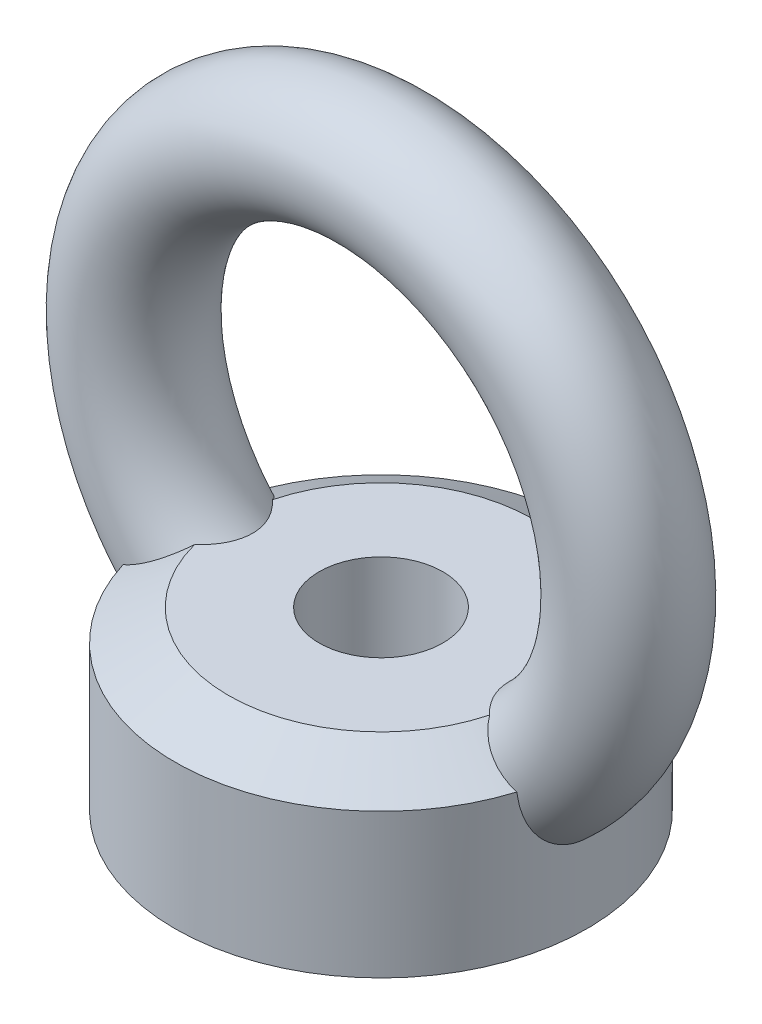
ISO-10303-21;
HEADER;
FILE_DESCRIPTION(('STEP AP214'),'2;1');
FILE_NAME('part.step','',(''),(''),'','','');
FILE_SCHEMA(('AUTOMOTIVE_DESIGN { 1 0 10303 214 1 1 1 1 }'));
ENDSEC;
DATA;
#1=APPLICATION_CONTEXT('core data for automotive mechanical design processes');
#2=APPLICATION_PROTOCOL_DEFINITION('international standard','automotive_design',2000,#1);
#3=PRODUCT_CONTEXT('',#1,'mechanical');
#4=PRODUCT('Part','Part','',(#3));
#5=PRODUCT_RELATED_PRODUCT_CATEGORY('part','',(#4));
#6=PRODUCT_DEFINITION_FORMATION('','',#4);
#7=PRODUCT_DEFINITION_CONTEXT('part definition',#1,'design');
#8=PRODUCT_DEFINITION('design','',#6,#7);
#9=PRODUCT_DEFINITION_SHAPE('','',#8);
#10=(LENGTH_UNIT() NAMED_UNIT(*) SI_UNIT(.MILLI.,.METRE.));
#11=(NAMED_UNIT(*) PLANE_ANGLE_UNIT() SI_UNIT($,.RADIAN.));
#12=(NAMED_UNIT(*) SI_UNIT($,.STERADIAN.) SOLID_ANGLE_UNIT());
#13=UNCERTAINTY_MEASURE_WITH_UNIT(LENGTH_MEASURE(1.E-05),#10,'distance_accuracy_value','');
#14=(GEOMETRIC_REPRESENTATION_CONTEXT(3) GLOBAL_UNCERTAINTY_ASSIGNED_CONTEXT((#13)) GLOBAL_UNIT_ASSIGNED_CONTEXT((#10,
#11,#12)) REPRESENTATION_CONTEXT('',''));
#15=CARTESIAN_POINT('',(0.,0.,0.));
#16=DIRECTION('',(0.,0.,1.));
#17=DIRECTION('',(1.,0.,0.));
#18=AXIS2_PLACEMENT_3D('',#15,#16,#17);
#19=CARTESIAN_POINT('',(0.,0.,0.));
#20=DIRECTION('',(0.,0.,1.));
#21=DIRECTION('',(1.,0.,0.));
#22=AXIS2_PLACEMENT_3D('',#19,#20,#21);
#23=TOROIDAL_SURFACE('',#22,12.,3.);
#24=CARTESIAN_POINT('',(6.22961505398123,-6.5,-0.139118721716831));
#25=CARTESIAN_POINT('',(6.23431642577709,-6.5,-0.20924029677985));
#26=CARTESIAN_POINT('',(6.24257847279546,-6.5,-0.279104205893454));
#27=CARTESIAN_POINT('',(6.26594476411456,-6.5,-0.417688683737671));
#28=CARTESIAN_POINT('',(6.28105147535224,-6.5,-0.48640883097033));
#29=CARTESIAN_POINT('',(6.33610184421861,-6.5,-0.69012020899211));
#30=CARTESIAN_POINT('',(6.38576857086786,-6.5,-0.822567748383374));
#31=CARTESIAN_POINT('',(6.50572465907828,-6.5,-1.07573157835286));
#32=CARTESIAN_POINT('',(6.57579152690675,-6.5,-1.19655664303812));
#33=CARTESIAN_POINT('',(6.73236503369914,-6.5,-1.42692696942571));
#34=CARTESIAN_POINT('',(6.81887791215169,-6.5,-1.53646792562554));
#35=CARTESIAN_POINT('',(7.05329928619922,-6.5,-1.79802284243207));
#36=CARTESIAN_POINT('',(7.20970887649716,-6.5,-1.94242415460222));
#37=CARTESIAN_POINT('',(7.54357574541464,-6.5,-2.20439747604694));
#38=CARTESIAN_POINT('',(7.72106955132949,-6.5,-2.32192186131845));
#39=CARTESIAN_POINT('',(8.09522978136465,-6.5,-2.53217750861442));
#40=CARTESIAN_POINT('',(8.29222911797675,-6.5,-2.62431425356034));
#41=CARTESIAN_POINT('',(8.69725927610269,-6.5,-2.7795167779617));
#42=CARTESIAN_POINT('',(8.90528794581485,-6.5,-2.84258820490253));
#43=CARTESIAN_POINT('',(9.3634961027106,-6.5,-2.94627503787804));
#44=CARTESIAN_POINT('',(9.61493555219613,-6.5,-2.98141728244163));
#45=CARTESIAN_POINT('',(10.120500875136,-6.5,-3.00730757183724));
#46=CARTESIAN_POINT('',(10.3746277728884,-6.5,-2.99803803277207));
#47=CARTESIAN_POINT('',(10.7462221424635,-6.5,-2.94931761893855));
#48=CARTESIAN_POINT('',(10.8662563183578,-6.5,-2.92799876133676));
#49=CARTESIAN_POINT('',(11.103766278026,-6.5,-2.87415859021771));
#50=CARTESIAN_POINT('',(11.2212434362972,-6.5,-2.84164346158286));
#51=CARTESIAN_POINT('',(11.4523834305152,-6.5,-2.76525142919736));
#52=CARTESIAN_POINT('',(11.5660481881755,-6.5,-2.72138034989283));
#53=CARTESIAN_POINT('',(11.7882862447324,-6.5,-2.62221767003497));
#54=CARTESIAN_POINT('',(11.8968605841973,-6.5,-2.56692841615128));
#55=CARTESIAN_POINT('',(12.0930803394763,-6.5,-2.45337685221773));
#56=CARTESIAN_POINT('',(12.1815589900521,-6.5,-2.39655172770514));
#57=CARTESIAN_POINT('',(12.3526534497551,-6.5,-2.274678012718));
#58=CARTESIAN_POINT('',(12.4352704568841,-6.5,-2.20963111021223));
#59=CARTESIAN_POINT('',(12.5935682812973,-6.5,-2.07169922511339));
#60=CARTESIAN_POINT('',(12.6692549350626,-6.5,-1.99882095236498));
#61=CARTESIAN_POINT('',(12.8127392853558,-6.5,-1.8456722010955));
#62=CARTESIAN_POINT('',(12.8805383743724,-6.5,-1.76540303187655));
#63=CARTESIAN_POINT('',(12.9979542360641,-6.5,-1.61040647548184));
#64=CARTESIAN_POINT('',(13.0487794017243,-6.5,-1.53659205260093));
#65=CARTESIAN_POINT('',(13.143371072177,-6.5,-1.38457784890463));
#66=CARTESIAN_POINT('',(13.187138714082,-6.5,-1.3063787772883));
#67=CARTESIAN_POINT('',(13.2670592537901,-6.5,-1.146227826244));
#68=CARTESIAN_POINT('',(13.3032166447645,-6.5,-1.06427819618002));
#69=CARTESIAN_POINT('',(13.367478958598,-6.5,-0.897310783764722));
#70=CARTESIAN_POINT('',(13.3955845407554,-6.5,-0.812293253261476));
#71=CARTESIAN_POINT('',(13.4622200161659,-6.5,-0.571792619994052));
#72=CARTESIAN_POINT('',(13.4914856405462,-6.5,-0.41362374164311));
#73=CARTESIAN_POINT('',(13.5215868486841,-6.5,-0.0947172941909798));
#74=CARTESIAN_POINT('',(13.522432560739,-6.5,0.0660193393806971));
#75=CARTESIAN_POINT('',(13.496354051466,-6.5,0.377685020920767));
#76=CARTESIAN_POINT('',(13.4707175059147,-6.5,0.528722901861146));
#77=CARTESIAN_POINT('',(13.3946825609898,-6.5,0.824400323547193));
#78=CARTESIAN_POINT('',(13.3442848308144,-6.5,0.969040037095202));
#79=CARTESIAN_POINT('',(13.2200696890922,-6.5,1.24959370132902));
#80=CARTESIAN_POINT('',(13.1460214935423,-6.5,1.38540508607424));
#81=CARTESIAN_POINT('',(12.9773846674516,-6.5,1.64357318177135));
#82=CARTESIAN_POINT('',(12.8827920444215,-6.5,1.76592727053556));
#83=CARTESIAN_POINT('',(12.6700545960602,-6.5,2.0016429427436));
#84=CARTESIAN_POINT('',(12.5508467696666,-6.5,2.11404293739055));
#85=CARTESIAN_POINT('',(12.2967454294337,-6.5,2.31937129739192));
#86=CARTESIAN_POINT('',(12.1618466425351,-6.5,2.4122930873898));
#87=CARTESIAN_POINT('',(11.8661476753837,-6.5,2.58594911949766));
#88=CARTESIAN_POINT('',(11.7041054435203,-6.5,2.66456444330563));
#89=CARTESIAN_POINT('',(11.3701964745857,-6.5,2.79691520007582));
#90=CARTESIAN_POINT('',(11.1983251348887,-6.5,2.85063886819055));
#91=CARTESIAN_POINT('',(10.8265804190547,-6.5,2.93890322068087));
#92=CARTESIAN_POINT('',(10.6259236356118,-6.5,2.97013960897791));
#93=CARTESIAN_POINT('',(10.2222575910805,-6.5,3.00279824096903));
#94=CARTESIAN_POINT('',(10.019247460162,-6.5,3.00420908480234));
#95=CARTESIAN_POINT('',(9.58778328130746,-6.5,2.97701876644261));
#96=CARTESIAN_POINT('',(9.35958141802106,-6.5,2.94435350101064));
#97=CARTESIAN_POINT('',(8.91062577884063,-6.5,2.84475197599344));
#98=CARTESIAN_POINT('',(8.68988170551142,-6.5,2.77777277569818));
#99=CARTESIAN_POINT('',(8.23981319579827,-6.5,2.6029324154661));
#100=CARTESIAN_POINT('',(8.01176371625751,-6.5,2.49171145090067));
#101=CARTESIAN_POINT('',(7.68721310498827,-6.5,2.29640556940399));
#102=CARTESIAN_POINT('',(7.58194992884721,-6.5,2.22655766033456));
#103=CARTESIAN_POINT('',(7.37843417937474,-6.5,2.07733915972367));
#104=CARTESIAN_POINT('',(7.28017802486109,-6.5,1.99797348899891));
#105=CARTESIAN_POINT('',(7.06226420152274,-6.5,1.80289463717005));
#106=CARTESIAN_POINT('',(6.9457232355188,-6.5,1.68364402597775));
#107=CARTESIAN_POINT('',(6.73235055271192,-6.5,1.42868316804597));
#108=CARTESIAN_POINT('',(6.63548575348173,-6.5,1.2930011717956));
#109=CARTESIAN_POINT('',(6.48549958416291,-6.5,1.03635763241479));
#110=CARTESIAN_POINT('',(6.42746396918077,-6.5,0.918286472952168));
#111=CARTESIAN_POINT('',(6.33159542755724,-6.5,0.674232433796836));
#112=CARTESIAN_POINT('',(6.29372615072143,-6.5,0.548264250060379));
#113=CARTESIAN_POINT('',(6.24887572307532,-6.5,0.328153948001659));
#114=CARTESIAN_POINT('',(6.23617161934253,-6.5,0.235155044648267));
#115=CARTESIAN_POINT('',(6.22340809745436,-6.5,0.0482453345787515));
#116=CARTESIAN_POINT('',(6.22334938992756,-6.5,-0.0456655230895523));
#117=CARTESIAN_POINT('',(6.22961505398123,-6.5,-0.139118721716831));
#118=B_SPLINE_CURVE_WITH_KNOTS('',3,(#24,#25,#26,#27,#28,#29,#30,#31,#32,#33,#34,#35,#36,#37,
#38,#39,#40,#41,#42,#43,#44,#45,#46,#47,#48,#49,#50,#51,#52,#53,#54,#55,#56,#57,#58,#59,#60,#61,
#62,#63,#64,#65,#66,#67,#68,#69,#70,#71,#72,#73,#74,#75,#76,#77,#78,#79,#80,#81,#82,#83,#84,#85,
#86,#87,#88,#89,#90,#91,#92,#93,#94,#95,#96,#97,#98,#99,#100,#101,#102,#103,#104,#105,#106,#107,
#108,#109,#110,#111,#112,#113,#114,#115,#116,#117),.UNSPECIFIED.,.T.,.F.,(4,2,2,2,2,2,2,2,2,2,2,
2,2,2,2,2,2,2,2,2,2,2,2,2,2,2,2,2,2,2,2,2,2,2,2,2,2,2,2,2,2,2,2,2,2,2,4),(0.,0.210711378644486,
0.421498761848976,0.843353435633543,1.26076928364396,1.6783438131875,2.3135164829531,
2.94980606060751,3.59992792066471,4.24992340662303,5.00792993989336,5.76623661445632,
6.13153372658511,6.4966293694237,6.86153812514976,7.22637195912547,7.54138174422883,
7.85632696110469,8.1710044555199,8.48562631147213,8.75411970986622,9.02256980512579,
9.29086095727912,9.55913013493226,10.0390062379377,10.5187113207301,10.9761412555233,
11.4335588284509,11.895583788414,12.3576986161949,12.8471790146016,13.3368243842373,
13.8749706490839,14.4133710057637,15.0201735950163,15.6272081109659,16.3159280359209,
17.0055119430096,17.7625916343935,18.1411333660396,18.5194802232681,19.0180153996826,
19.5157052989184,19.9089026625575,20.3013888609519,20.5821946723144,20.8630162640113),.UNSPECIFIED.);
#119=CARTESIAN_POINT('',(7.15719507818516,-6.5,1.88760016574884));
#120=VERTEX_POINT('',#119);
#121=CARTESIAN_POINT('',(7.15719507818522,-6.5,-1.8876001657489));
#122=VERTEX_POINT('',#121);
#123=EDGE_CURVE('E99',#120,#122,#118,.T.);
#124=ORIENTED_EDGE('',*,*,#123,.F.);
#125=CARTESIAN_POINT('',(7.1571950781852,-6.5,1.88760016574885));
#126=CARTESIAN_POINT('',(7.19838081043544,-6.53252102151386,1.95228621957304));
#127=CARTESIAN_POINT('',(7.24198486460151,-6.56637400261549,2.01475896769266));
#128=CARTESIAN_POINT('',(7.3337929299164,-6.63633843801253,2.13486604212236));
#129=CARTESIAN_POINT('',(7.3819966733078,-6.67244976080308,2.19250064970391));
#130=CARTESIAN_POINT('',(7.48267599805588,-6.74645853747505,2.30242213715623));
#131=CARTESIAN_POINT('',(7.5351432409869,-6.78435244665619,2.3547190248));
#132=CARTESIAN_POINT('',(7.64409444132552,-6.8615818649885,2.45372813827598));
#133=CARTESIAN_POINT('',(7.70057831687612,-6.90091734475325,2.50044047786655));
#134=CARTESIAN_POINT('',(7.8755884781999,-7.02054674569193,2.6317534510405));
#135=CARTESIAN_POINT('',(7.99972893734221,-7.10250483446544,2.70759073335139));
#136=CARTESIAN_POINT('',(8.25939086493228,-7.26792686461893,2.83386197175203));
#137=CARTESIAN_POINT('',(8.39491891285618,-7.35139165436506,2.88428112245873));
#138=CARTESIAN_POINT('',(8.67490722789012,-7.51832721618366,2.95913121558864));
#139=CARTESIAN_POINT('',(8.81944394036222,-7.6017895194639,2.9832942932968));
#140=CARTESIAN_POINT('',(9.11185128154503,-7.76577538225907,3.00437514810489));
#141=CARTESIAN_POINT('',(9.2597154711961,-7.84630394035077,3.00134167496995));
#142=CARTESIAN_POINT('',(9.45494448753648,-7.94995310335489,2.97963406587679));
#143=CARTESIAN_POINT('',(9.50273415951123,-7.97511171676564,2.97290778276331));
#144=CARTESIAN_POINT('',(9.55039629776859,-7.99999999999966,2.96478170453682));
#145=B_SPLINE_CURVE_WITH_KNOTS('',3,(#125,#126,#127,#128,#129,#130,#131,#132,#133,#134,#135,
#136,#137,#138,#139,#140,#141,#142,#143,#144),.UNSPECIFIED.,.F.,.F.,(4,2,2,2,2,2,2,2,2,4),(0.,
0.249807179797362,0.499599826662996,0.748915181047893,0.998225455963227,1.49657328991507,
1.99521106376258,2.49888952051778,3.00166531536714,3.16485654651574),.UNSPECIFIED.);
#146=CARTESIAN_POINT('',(9.55039629776861,-7.99999999998039,2.96478170453873));
#147=VERTEX_POINT('',#146);
#148=EDGE_CURVE('E164',#120,#147,#145,.T.);
#149=ORIENTED_EDGE('',*,*,#148,.T.);
#150=CARTESIAN_POINT('',(9.54990714086433,-6.4998,2.96635695776291));
#151=CARTESIAN_POINT('',(9.54775548393945,-6.58449541792761,2.9732833206193));
#152=CARTESIAN_POINT('',(9.5458884346595,-6.66927434902592,2.97926847417023));
#153=CARTESIAN_POINT('',(9.54280978230569,-6.83898928503649,2.98911492364898));
#154=CARTESIAN_POINT('',(9.54159835700227,-6.92392532629076,2.99297564354787));
#155=CARTESIAN_POINT('',(9.53907201848955,-7.17953971501327,3.00102444066987));
#156=CARTESIAN_POINT('',(9.53888297634104,-7.3503713919944,3.00162198323009));
#157=CARTESIAN_POINT('',(9.54224333341893,-7.69458361807565,2.99092497362465));
#158=CARTESIAN_POINT('',(9.54585642945241,-7.86795805037568,2.97942780109827));
#159=CARTESIAN_POINT('',(9.55760077492462,-8.21274838910501,2.94154532840782));
#160=CARTESIAN_POINT('',(9.56572428075478,-8.38416713975925,2.91518554362888));
#161=CARTESIAN_POINT('',(9.58241278202929,-8.65105357561292,2.85968417197539));
#162=CARTESIAN_POINT('',(9.58932546602975,-8.74786291048933,2.83647707028412));
#163=CARTESIAN_POINT('',(9.60478763480938,-8.93957470846949,2.78366725817626));
#164=CARTESIAN_POINT('',(9.61333724168305,-9.03447702874941,2.75406407066851));
#165=CARTESIAN_POINT('',(9.64132883485294,-9.31455266908,2.65510544882976));
#166=CARTESIAN_POINT('',(9.66317658261558,-9.49610923955348,2.57540382590633));
#167=CARTESIAN_POINT('',(9.69970775589249,-9.75658400466925,2.43270589166149));
#168=CARTESIAN_POINT('',(9.71261532618291,-9.84198749898814,2.38083576162234));
#169=CARTESIAN_POINT('',(9.73928187430795,-10.0073769621704,2.26929276248897));
#170=CARTESIAN_POINT('',(9.75304034998793,-10.0873660689965,2.20962447269856));
#171=CARTESIAN_POINT('',(9.78096024195274,-10.2409566235295,2.0825568919791));
#172=CARTESIAN_POINT('',(9.79512187686324,-10.3145545142826,2.01515334391514));
#173=CARTESIAN_POINT('',(9.82329367956218,-10.4543157513625,1.87300445390803));
#174=CARTESIAN_POINT('',(9.8373038752499,-10.5204804889302,1.79826049077283));
#175=CARTESIAN_POINT('',(9.86264104117694,-10.6356355299449,1.65315921785374));
#176=CARTESIAN_POINT('',(9.87406603003051,-10.6857298291171,1.58369259524243));
#177=CARTESIAN_POINT('',(9.89599931424425,-10.7792865599813,1.44029753121752));
#178=CARTESIAN_POINT('',(9.90650772547417,-10.8227498304611,1.36636965578096));
#179=CARTESIAN_POINT('',(9.92625042905014,-10.9026090628484,1.21465804715351));
#180=CARTESIAN_POINT('',(9.93548522428973,-10.9390078165407,1.1368758524455));
#181=CARTESIAN_POINT('',(9.95236939297358,-11.0044136029117,0.9781273911417));
#182=CARTESIAN_POINT('',(9.96001887016909,-11.0334211193389,0.897161333326917));
#183=CARTESIAN_POINT('',(9.97881388995341,-11.1038432714105,0.667179621626028));
#184=CARTESIAN_POINT('',(9.98789724177301,-11.1367612418312,0.515285458531804));
#185=CARTESIAN_POINT('',(9.99902002164391,-11.17690696811,0.2079975352394));
#186=CARTESIAN_POINT('',(10.0010613845624,-11.1841417807261,0.0526047481411757));
#187=CARTESIAN_POINT('',(9.99792708044686,-11.1729178269095,-0.253781318037116));
#188=CARTESIAN_POINT('',(9.99290808576702,-11.1550168503406,-0.40479655349717));
#189=CARTESIAN_POINT('',(9.97646849385712,-11.0949643881669,-0.701548338806778));
#190=CARTESIAN_POINT('',(9.96504829132548,-11.0528143977519,-0.847285213530227));
#191=CARTESIAN_POINT('',(9.93701431941373,-10.9453549348717,-1.12955668362646));
#192=CARTESIAN_POINT('',(9.9203959617717,-10.8800249952625,-1.26608301919176));
#193=CARTESIAN_POINT('',(9.88372378582646,-10.7281193691467,-1.52619938874647));
#194=CARTESIAN_POINT('',(9.86367007745144,-10.6415443624252,-1.64978983646903));
#195=CARTESIAN_POINT('',(9.82167554125696,-10.4476037349975,-1.88393011317662));
#196=CARTESIAN_POINT('',(9.79970194195113,-10.3398061437377,-1.99411509123016));
#197=CARTESIAN_POINT('',(9.75638623378361,-10.1082746716836,-2.1962805158587));
#198=CARTESIAN_POINT('',(9.73504426664999,-9.98453724709102,-2.28825690266728));
#199=CARTESIAN_POINT('',(9.69301447619685,-9.71402765510346,-2.46048921065607));
#200=CARTESIAN_POINT('',(9.67253147403218,-9.56619404381407,-2.53911621663093));
#201=CARTESIAN_POINT('',(9.63570358040169,-9.26078770624078,-2.67548435213015));
#202=CARTESIAN_POINT('',(9.61936041087633,-9.10321096114635,-2.73321679494373));
#203=CARTESIAN_POINT('',(9.59341503586154,-8.80569920179877,-2.8228001936175));
#204=CARTESIAN_POINT('',(9.5831757488708,-8.66656589308124,-2.8572050580259));
#205=CARTESIAN_POINT('',(9.56606609904184,-8.38560454527169,-2.91397650671255));
#206=CARTESIAN_POINT('',(9.55919806582734,-8.24377471291569,-2.93633476751456));
#207=CARTESIAN_POINT('',(9.5485809794778,-7.95831700135585,-2.9706763132914));
#208=CARTESIAN_POINT('',(9.5448424062549,-7.81468470266451,-2.98262474330944));
#209=CARTESIAN_POINT('',(9.54015121421366,-7.52698265015869,-2.99759419223329));
#210=CARTESIAN_POINT('',(9.53919779488349,-7.3829130339583,-3.00061777633019));
#211=CARTESIAN_POINT('',(9.53961952453492,-7.11511887907122,-2.99927638903733));
#212=CARTESIAN_POINT('',(9.54068588123003,-6.99138422423803,-2.99589124871934));
#213=CARTESIAN_POINT('',(9.54427903216292,-6.74496578038939,-2.98441931636815));
#214=CARTESIAN_POINT('',(9.54679616222258,-6.62228043720827,-2.97636363458021));
#215=CARTESIAN_POINT('',(9.54990714086433,-6.4998,-2.96635695776291));
#216=B_SPLINE_CURVE_WITH_KNOTS('',3,(#150,#151,#152,#153,#154,#155,#156,#157,#158,#159,#160,
#161,#162,#163,#164,#165,#166,#167,#168,#169,#170,#171,#172,#173,#174,#175,#176,#177,#178,#179,
#180,#181,#182,#183,#184,#185,#186,#187,#188,#189,#190,#191,#192,#193,#194,#195,#196,#197,#198,
#199,#200,#201,#202,#203,#204,#205,#206,#207,#208,#209,#210,#211,#212,#213,#214,#215),
.UNSPECIFIED.,.F.,.F.,(4,2,2,2,2,2,2,2,2,2,2,2,2,2,2,2,2,2,2,2,2,2,2,2,2,2,2,2,2,2,2,2,4),(0.,
0.255005428827307,0.510079966999231,1.02219341676646,1.54302492092291,2.06296499834589,
2.36211674429051,2.66129081200513,3.25655916344566,3.5584516208698,3.86016758829466,
4.16205041009644,4.46387663493625,4.72272804804858,4.98154669072245,5.24026284318795,
5.49896205860598,5.96353302922945,6.42797634348052,6.88227451374736,7.336544675073,
7.79121694450546,8.2458746675441,8.71097828343142,9.17618548178257,9.68039146876519,
10.1848068343286,10.6152499544431,11.0459901046288,11.4781670080982,11.9102196826053,
12.2814747695763,12.6502849007628),.UNSPECIFIED.);
#217=CARTESIAN_POINT('',(9.55039629776924,-8.,-2.9647817045367));
#218=VERTEX_POINT('',#217);
#219=EDGE_CURVE('E104',#147,#218,#216,.T.);
#220=ORIENTED_EDGE('',*,*,#219,.T.);
#221=CARTESIAN_POINT('',(9.55039629776924,-8.,-2.9647817045367));
#222=CARTESIAN_POINT('',(9.47481623270165,-7.96053031458683,-2.97765377010686));
#223=CARTESIAN_POINT('',(9.39900948380341,-7.92043681724735,-2.9870188458826));
#224=CARTESIAN_POINT('',(9.2474265282904,-7.83916339523063,-2.99866527426291));
#225=CARTESIAN_POINT('',(9.17165032486951,-7.79798337725441,-3.00094601652966));
#226=CARTESIAN_POINT('',(8.94531160050052,-7.67317517654512,-2.99705808835067));
#227=CARTESIAN_POINT('',(8.79553777416146,-7.58817425689583,-2.98019343527431));
#228=CARTESIAN_POINT('',(8.5027501588469,-7.41658182732374,-2.91796262204219));
#229=CARTESIAN_POINT('',(8.35974758618083,-7.32998798699425,-2.87255083652214));
#230=CARTESIAN_POINT('',(8.08503884478644,-7.15776914153865,-2.7540267384408));
#231=CARTESIAN_POINT('',(7.95332588855239,-7.07214358153368,-2.68093121510371));
#232=CARTESIAN_POINT('',(7.76368701405142,-6.94435183892006,-2.54952311185568));
#233=CARTESIAN_POINT('',(7.70020014932585,-6.90069187926299,-2.50043474304236));
#234=CARTESIAN_POINT('',(7.57794262956927,-6.81496789151662,-2.39540538263073));
#235=CARTESIAN_POINT('',(7.51917238521932,-6.7729040025666,-2.33946379538464));
#236=CARTESIAN_POINT('',(7.40659076245699,-6.69074804491767,-2.22095686304961));
#237=CARTESIAN_POINT('',(7.35279985130174,-6.65066440539522,-2.15836626938539));
#238=CARTESIAN_POINT('',(7.25075967155018,-6.57318293870279,-2.02727848702721));
#239=CARTESIAN_POINT('',(7.20251064414939,-6.53578522845715,-1.95878104148047));
#240=CARTESIAN_POINT('',(7.1571950781852,-6.5,-1.88760016574888));
#241=B_SPLINE_CURVE_WITH_KNOTS('',3,(#221,#222,#223,#224,#225,#226,#227,#228,#229,#230,#231,
#232,#233,#234,#235,#236,#237,#238,#239,#240),.UNSPECIFIED.,.F.,.F.,(4,2,2,2,2,2,2,2,2,4),(0.,
0.258541014341206,0.517104302193436,1.03355146383669,1.55082614142486,2.06778761095264,
2.34153391501323,2.61530402864852,2.89015365485613,3.16501523862181),.UNSPECIFIED.);
#242=EDGE_CURVE('E11',#218,#122,#241,.T.);
#243=ORIENTED_EDGE('',*,*,#242,.T.);
#244=EDGE_LOOP('',(#124,#149,#220,#243));
#245=FACE_BOUND('',#244,.T.);
#246=CARTESIAN_POINT('',(-8.1187611156505,-6.5,-2.53784529246474));
#247=CARTESIAN_POINT('',(-8.00382137557446,-6.5,-2.48128333631229));
#248=CARTESIAN_POINT('',(-7.8913607538669,-6.5,-2.41977213730255));
#249=CARTESIAN_POINT('',(-7.67233502897942,-6.5,-2.28686871944308));
#250=CARTESIAN_POINT('',(-7.56577206487713,-6.5,-2.21547294791526));
#251=CARTESIAN_POINT('',(-7.36011571698074,-6.5,-2.06299033783461));
#252=CARTESIAN_POINT('',(-7.26100799762773,-6.5,-1.98192291592937));
#253=CARTESIAN_POINT('',(-7.071759005994,-6.5,-1.8100254154456));
#254=CARTESIAN_POINT('',(-6.98161035706991,-6.5,-1.71920349883149));
#255=CARTESIAN_POINT('',(-6.79880493328606,-6.5,-1.51247801365356));
#256=CARTESIAN_POINT('',(-6.7080316735318,-6.5,-1.39488300591129));
#257=CARTESIAN_POINT('',(-6.54576138477939,-6.5,-1.14714163359488));
#258=CARTESIAN_POINT('',(-6.47422896436883,-6.5,-1.01701891965135));
#259=CARTESIAN_POINT('',(-6.36525192412673,-6.5,-0.767984335426356));
#260=CARTESIAN_POINT('',(-6.32415760261202,-6.5,-0.650684856496817));
#261=CARTESIAN_POINT('',(-6.2621969443892,-6.5,-0.410837205604766));
#262=CARTESIAN_POINT('',(-6.24131511626931,-6.5,-0.288293128590381));
#263=CARTESIAN_POINT('',(-6.22165399792422,-6.5,-0.0409850711191401));
#264=CARTESIAN_POINT('',(-6.22295039231693,-6.5,0.0837850587416337));
#265=CARTESIAN_POINT('',(-6.24770393696448,-6.5,0.331102246232157));
#266=CARTESIAN_POINT('',(-6.27116871219184,-6.5,0.453648524170012));
#267=CARTESIAN_POINT('',(-6.33654033461294,-6.5,0.68746848447005));
#268=CARTESIAN_POINT('',(-6.37754048736315,-6.5,0.799001375729021));
#269=CARTESIAN_POINT('',(-6.47499234698551,-6.5,1.01503727994302));
#270=CARTESIAN_POINT('',(-6.53145180642828,-6.5,1.11953673290852));
#271=CARTESIAN_POINT('',(-6.68967101736384,-6.5,1.37266756237277));
#272=CARTESIAN_POINT('',(-6.79974497613744,-6.5,1.51611025325174));
#273=CARTESIAN_POINT('',(-7.0413899241104,-6.5,1.78366732790357));
#274=CARTESIAN_POINT('',(-7.17301562203467,-6.5,1.9077309098891));
#275=CARTESIAN_POINT('',(-7.49620678489602,-6.5,2.17247086279376));
#276=CARTESIAN_POINT('',(-7.6935862640875,-6.5,2.3060527929192));
#277=CARTESIAN_POINT('',(-8.10724397940751,-6.5,2.5393420448511));
#278=CARTESIAN_POINT('',(-8.32352885155506,-6.5,2.63903741155426));
#279=CARTESIAN_POINT('',(-8.7715932730353,-6.5,2.80452046155491));
#280=CARTESIAN_POINT('',(-9.00352574439053,-6.5,2.86989345314554));
#281=CARTESIAN_POINT('',(-9.47506602849994,-6.5,2.96288175505811));
#282=CARTESIAN_POINT('',(-9.71467506848593,-6.5,2.99049099705633));
#283=CARTESIAN_POINT('',(-10.0809186539159,-6.5,3.00186055713018));
#284=CARTESIAN_POINT('',(-10.2072327786922,-6.5,3.00020768706208));
#285=CARTESIAN_POINT('',(-10.4591671810282,-6.5,2.98541185848318));
#286=CARTESIAN_POINT('',(-10.5847877571066,-6.5,2.97227430693662));
#287=CARTESIAN_POINT('',(-10.8341392293226,-6.5,2.93418333540012));
#288=CARTESIAN_POINT('',(-10.9578715314863,-6.5,2.90923919922757));
#289=CARTESIAN_POINT('',(-11.2022269879652,-6.5,2.8472981225612));
#290=CARTESIAN_POINT('',(-11.3228511584327,-6.5,2.81030517659348));
#291=CARTESIAN_POINT('',(-11.6197893442409,-6.5,2.70217543935852));
#292=CARTESIAN_POINT('',(-11.7933527517155,-6.5,2.62323566191617));
#293=CARTESIAN_POINT('',(-12.1249693537118,-6.5,2.43768654618549));
#294=CARTESIAN_POINT('',(-12.2830300912767,-6.5,2.33109075728213));
#295=CARTESIAN_POINT('',(-12.5787455507177,-6.5,2.0908298656107));
#296=CARTESIAN_POINT('',(-12.7162780597302,-6.5,1.95701304291003));
#297=CARTESIAN_POINT('',(-12.963556667805,-6.5,1.66570744701239));
#298=CARTESIAN_POINT('',(-13.0733170224506,-6.5,1.50823088490976));
#299=CARTESIAN_POINT('',(-13.2492919269778,-6.5,1.19260307352339));
#300=CARTESIAN_POINT('',(-13.318926269819,-6.5,1.03635641734639));
#301=CARTESIAN_POINT('',(-13.4282895785728,-6.5,0.713737947252635));
#302=CARTESIAN_POINT('',(-13.4680368017687,-6.5,0.547372381975304));
#303=CARTESIAN_POINT('',(-13.5137294425405,-6.5,0.224032436322464));
#304=CARTESIAN_POINT('',(-13.522181340771,-6.5,0.0674079288610464));
#305=CARTESIAN_POINT('',(-13.5119157376284,-6.5,-0.244928415036985));
#306=CARTESIAN_POINT('',(-13.4932043214456,-6.5,-0.400640448042845));
#307=CARTESIAN_POINT('',(-13.4302426454307,-6.5,-0.702646511745273));
#308=CARTESIAN_POINT('',(-13.3866523904479,-6.5,-0.849079257499805));
#309=CARTESIAN_POINT('',(-13.276171724493,-6.5,-1.13284443342599));
#310=CARTESIAN_POINT('',(-13.2092798075937,-6.5,-1.2701762747464));
#311=CARTESIAN_POINT('',(-13.0524220072409,-6.5,-1.53627830975696));
#312=CARTESIAN_POINT('',(-12.9618484731561,-6.5,-1.66468921544963));
#313=CARTESIAN_POINT('',(-12.7618192180382,-6.5,-1.90580334824141));
#314=CARTESIAN_POINT('',(-12.6523586582168,-6.5,-2.01850253664446));
#315=CARTESIAN_POINT('',(-12.4091787840369,-6.5,-2.23415264908291));
#316=CARTESIAN_POINT('',(-12.2742579370642,-6.5,-2.33574582172108));
#317=CARTESIAN_POINT('',(-11.9907019408454,-6.5,-2.51745283535063));
#318=CARTESIAN_POINT('',(-11.8420618631834,-6.5,-2.59755891676276));
#319=CARTESIAN_POINT('',(-11.5179452267444,-6.5,-2.74353163440399));
#320=CARTESIAN_POINT('',(-11.3413191925312,-6.5,-2.80684128136328));
#321=CARTESIAN_POINT('',(-10.9806847469892,-6.5,-2.90675829494997));
#322=CARTESIAN_POINT('',(-10.7966720416308,-6.5,-2.94334988552735));
#323=CARTESIAN_POINT('',(-10.400641492805,-6.5,-2.99383951904441));
#324=CARTESIAN_POINT('',(-10.188156780981,-6.5,-3.00406769837319));
#325=CARTESIAN_POINT('',(-9.76411210775779,-6.5,-2.9930397703116));
#326=CARTESIAN_POINT('',(-9.55255215786236,-6.5,-2.97178327236855));
#327=CARTESIAN_POINT('',(-9.13154117527758,-6.5,-2.89904625920325));
#328=CARTESIAN_POINT('',(-8.92216685927395,-6.5,-2.84712604561821));
#329=CARTESIAN_POINT('',(-8.51243383158083,-6.5,-2.71411837848345));
#330=CARTESIAN_POINT('',(-8.31209057727245,-6.5,-2.63298290565234));
#331=CARTESIAN_POINT('',(-8.1187611156505,-6.5,-2.53784529246474));
#332=B_SPLINE_CURVE_WITH_KNOTS('',3,(#246,#247,#248,#249,#250,#251,#252,#253,#254,#255,#256,
#257,#258,#259,#260,#261,#262,#263,#264,#265,#266,#267,#268,#269,#270,#271,#272,#273,#274,#275,
#276,#277,#278,#279,#280,#281,#282,#283,#284,#285,#286,#287,#288,#289,#290,#291,#292,#293,#294,
#295,#296,#297,#298,#299,#300,#301,#302,#303,#304,#305,#306,#307,#308,#309,#310,#311,#312,#313,
#314,#315,#316,#317,#318,#319,#320,#321,#322,#323,#324,#325,#326,#327,#328,#329,#330,#331),
.UNSPECIFIED.,.T.,.F.,(4,2,2,2,2,2,2,2,2,2,2,2,2,2,2,2,2,2,2,2,2,2,2,2,2,2,2,2,2,2,2,2,2,2,2,2,
2,2,2,2,2,2,4),(0.,0.384112269329303,0.768362955074919,1.15185481113488,1.53502824837133,
1.97917398075883,2.42249708075792,2.79380727867129,3.16483266835398,3.5371244579694,
3.90954434663623,4.26467557972427,4.6199852320923,5.15939685864902,5.7001996280967,
6.41150684762163,7.12306475489425,7.84303277059623,8.56311646564555,8.94165403101496,
9.32001347760372,9.69807590355726,10.0760131183339,10.6454455139244,11.2145994551536,
11.7870171281932,12.3591403776117,12.8695581499681,13.3796638671765,13.8479036506243,
14.3160385540694,14.772296149915,15.2285832380014,15.6979782445915,16.1674936875454,
16.672094020276,17.1768763334697,17.7375226319583,18.2984997047811,18.9341620248839,
19.5698322301462,20.2148467579054,20.8609263312774),.UNSPECIFIED.);
#333=CARTESIAN_POINT('',(-7.15719507818506,-6.5,-1.88760016574875));
#334=VERTEX_POINT('',#333);
#335=CARTESIAN_POINT('',(-7.15719507818523,-6.5,1.8876001657489));
#336=VERTEX_POINT('',#335);
#337=EDGE_CURVE('E96',#334,#336,#332,.T.);
#338=ORIENTED_EDGE('',*,*,#337,.F.);
#339=CARTESIAN_POINT('',(-7.15719507818522,-6.5,-1.88760016574879));
#340=CARTESIAN_POINT('',(-7.19838081043543,-6.53252102151385,-1.952286219573));
#341=CARTESIAN_POINT('',(-7.24198486460149,-6.56637400261548,-2.01475896769263));
#342=CARTESIAN_POINT('',(-7.33379292991637,-6.63633843801252,-2.13486604212234));
#343=CARTESIAN_POINT('',(-7.38199667330777,-6.67244976080307,-2.19250064970388));
#344=CARTESIAN_POINT('',(-7.48267599805585,-6.74645853747503,-2.30242213715621));
#345=CARTESIAN_POINT('',(-7.53514324098687,-6.78435244665617,-2.35471902479998));
#346=CARTESIAN_POINT('',(-7.6440944413255,-6.86158186498848,-2.45372813827595));
#347=CARTESIAN_POINT('',(-7.7005783168761,-6.90091734475323,-2.50044047786653));
#348=CARTESIAN_POINT('',(-7.87558847819986,-7.02054674569191,-2.63175345104048));
#349=CARTESIAN_POINT('',(-7.99972893734218,-7.10250483446541,-2.70759073335137));
#350=CARTESIAN_POINT('',(-8.25939086493224,-7.26792686461891,-2.83386197175201));
#351=CARTESIAN_POINT('',(-8.39491891285614,-7.35139165436503,-2.88428112245872));
#352=CARTESIAN_POINT('',(-8.67490722789008,-7.51832721618364,-2.95913121558863));
#353=CARTESIAN_POINT('',(-8.81944394036218,-7.60178951946388,-2.98329429329679));
#354=CARTESIAN_POINT('',(-9.11185128154499,-7.76577538225905,-3.00437514810489));
#355=CARTESIAN_POINT('',(-9.25971547119606,-7.84630394035075,-3.00134167496995));
#356=CARTESIAN_POINT('',(-9.45494448753645,-7.94995310335488,-2.9796340658768));
#357=CARTESIAN_POINT('',(-9.50273415951121,-7.97511171676563,-2.97290778276331));
#358=CARTESIAN_POINT('',(-9.55039629776859,-7.99999999999966,-2.96478170453682));
#359=B_SPLINE_CURVE_WITH_KNOTS('',3,(#339,#340,#341,#342,#343,#344,#345,#346,#347,#348,#349,
#350,#351,#352,#353,#354,#355,#356,#357,#358),.UNSPECIFIED.,.F.,.F.,(4,2,2,2,2,2,2,2,2,4),(0.,
0.249807179797365,0.499599826662999,0.748915181047893,0.998225455963226,1.49657328991506,
1.99521106376258,2.49888952051778,3.00166531536714,3.16485654651578),.UNSPECIFIED.);
#360=CARTESIAN_POINT('',(-9.55039629776861,-7.99999999998039,-2.96478170453873));
#361=VERTEX_POINT('',#360);
#362=EDGE_CURVE('E54',#334,#361,#359,.T.);
#363=ORIENTED_EDGE('',*,*,#362,.T.);
#364=CARTESIAN_POINT('',(-9.54990714086433,-6.4998,-2.96635695776291));
#365=CARTESIAN_POINT('',(-9.54775548393945,-6.58449541792761,-2.9732833206193));
#366=CARTESIAN_POINT('',(-9.5458884346595,-6.66927434902592,-2.97926847417023));
#367=CARTESIAN_POINT('',(-9.54280978230569,-6.83898928503649,-2.98911492364898));
#368=CARTESIAN_POINT('',(-9.54159835700227,-6.92392532629076,-2.99297564354787));
#369=CARTESIAN_POINT('',(-9.53907201848955,-7.17953971501327,-3.00102444066987));
#370=CARTESIAN_POINT('',(-9.53888297634104,-7.3503713919944,-3.00162198323009));
#371=CARTESIAN_POINT('',(-9.54224333341893,-7.69458361807565,-2.99092497362465));
#372=CARTESIAN_POINT('',(-9.54585642945241,-7.86795805037568,-2.97942780109827));
#373=CARTESIAN_POINT('',(-9.55760077492462,-8.21274838910501,-2.94154532840782));
#374=CARTESIAN_POINT('',(-9.56572428075478,-8.38416713975925,-2.91518554362888));
#375=CARTESIAN_POINT('',(-9.58241278202929,-8.65105357561292,-2.85968417197539));
#376=CARTESIAN_POINT('',(-9.58932546602975,-8.74786291048933,-2.83647707028412));
#377=CARTESIAN_POINT('',(-9.60478763480938,-8.93957470846949,-2.78366725817626));
#378=CARTESIAN_POINT('',(-9.61333724168305,-9.03447702874941,-2.75406407066851));
#379=CARTESIAN_POINT('',(-9.64132883485294,-9.31455266908,-2.65510544882976));
#380=CARTESIAN_POINT('',(-9.66317658261558,-9.49610923955348,-2.57540382590633));
#381=CARTESIAN_POINT('',(-9.69970775589249,-9.75658400466925,-2.43270589166149));
#382=CARTESIAN_POINT('',(-9.71261532618291,-9.84198749898814,-2.38083576162234));
#383=CARTESIAN_POINT('',(-9.73928187430795,-10.0073769621704,-2.26929276248897));
#384=CARTESIAN_POINT('',(-9.75304034998793,-10.0873660689965,-2.20962447269856));
#385=CARTESIAN_POINT('',(-9.78096024195274,-10.2409566235295,-2.0825568919791));
#386=CARTESIAN_POINT('',(-9.79512187686324,-10.3145545142826,-2.01515334391514));
#387=CARTESIAN_POINT('',(-9.82329367956218,-10.4543157513625,-1.87300445390803));
#388=CARTESIAN_POINT('',(-9.8373038752499,-10.5204804889302,-1.79826049077283));
#389=CARTESIAN_POINT('',(-9.86264104117694,-10.6356355299449,-1.65315921785374));
#390=CARTESIAN_POINT('',(-9.87406603003051,-10.6857298291171,-1.58369259524243));
#391=CARTESIAN_POINT('',(-9.89599931424425,-10.7792865599813,-1.44029753121752));
#392=CARTESIAN_POINT('',(-9.90650772547417,-10.8227498304611,-1.36636965578096));
#393=CARTESIAN_POINT('',(-9.92625042905014,-10.9026090628484,-1.21465804715351));
#394=CARTESIAN_POINT('',(-9.93548522428973,-10.9390078165407,-1.1368758524455));
#395=CARTESIAN_POINT('',(-9.95236939297358,-11.0044136029117,-0.9781273911417));
#396=CARTESIAN_POINT('',(-9.96001887016909,-11.0334211193389,-0.897161333326917));
#397=CARTESIAN_POINT('',(-9.97881388995341,-11.1038432714105,-0.667179621626028));
#398=CARTESIAN_POINT('',(-9.98789724177301,-11.1367612418312,-0.515285458531804));
#399=CARTESIAN_POINT('',(-9.99902002164391,-11.17690696811,-0.2079975352394));
#400=CARTESIAN_POINT('',(-10.0010613845624,-11.1841417807261,-0.0526047481411757));
#401=CARTESIAN_POINT('',(-9.99792708044686,-11.1729178269095,0.253781318037116));
#402=CARTESIAN_POINT('',(-9.99290808576702,-11.1550168503406,0.40479655349717));
#403=CARTESIAN_POINT('',(-9.97646849385712,-11.0949643881669,0.701548338806778));
#404=CARTESIAN_POINT('',(-9.96504829132548,-11.0528143977519,0.847285213530227));
#405=CARTESIAN_POINT('',(-9.93701431941373,-10.9453549348717,1.12955668362646));
#406=CARTESIAN_POINT('',(-9.9203959617717,-10.8800249952625,1.26608301919176));
#407=CARTESIAN_POINT('',(-9.88372378582646,-10.7281193691467,1.52619938874647));
#408=CARTESIAN_POINT('',(-9.86367007745144,-10.6415443624252,1.64978983646903));
#409=CARTESIAN_POINT('',(-9.82167554125696,-10.4476037349975,1.88393011317662));
#410=CARTESIAN_POINT('',(-9.79970194195113,-10.3398061437377,1.99411509123016));
#411=CARTESIAN_POINT('',(-9.75638623378361,-10.1082746716836,2.1962805158587));
#412=CARTESIAN_POINT('',(-9.73504426664999,-9.98453724709102,2.28825690266728));
#413=CARTESIAN_POINT('',(-9.69301447619685,-9.71402765510346,2.46048921065607));
#414=CARTESIAN_POINT('',(-9.67253147403218,-9.56619404381407,2.53911621663093));
#415=CARTESIAN_POINT('',(-9.63570358040169,-9.26078770624078,2.67548435213015));
#416=CARTESIAN_POINT('',(-9.61936041087633,-9.10321096114635,2.73321679494373));
#417=CARTESIAN_POINT('',(-9.59341503586154,-8.80569920179877,2.8228001936175));
#418=CARTESIAN_POINT('',(-9.5831757488708,-8.66656589308124,2.8572050580259));
#419=CARTESIAN_POINT('',(-9.56606609904184,-8.38560454527169,2.91397650671255));
#420=CARTESIAN_POINT('',(-9.55919806582734,-8.24377471291569,2.93633476751456));
#421=CARTESIAN_POINT('',(-9.5485809794778,-7.95831700135585,2.9706763132914));
#422=CARTESIAN_POINT('',(-9.5448424062549,-7.81468470266451,2.98262474330944));
#423=CARTESIAN_POINT('',(-9.54015121421366,-7.52698265015869,2.99759419223329));
#424=CARTESIAN_POINT('',(-9.53919779488349,-7.3829130339583,3.00061777633019));
#425=CARTESIAN_POINT('',(-9.53961952453492,-7.11511887907122,2.99927638903733));
#426=CARTESIAN_POINT('',(-9.54068588123003,-6.99138422423803,2.99589124871934));
#427=CARTESIAN_POINT('',(-9.54427903216292,-6.74496578038939,2.98441931636815));
#428=CARTESIAN_POINT('',(-9.54679616222258,-6.62228043720827,2.97636363458021));
#429=CARTESIAN_POINT('',(-9.54990714086433,-6.4998,2.96635695776291));
#430=B_SPLINE_CURVE_WITH_KNOTS('',3,(#364,#365,#366,#367,#368,#369,#370,#371,#372,#373,#374,
#375,#376,#377,#378,#379,#380,#381,#382,#383,#384,#385,#386,#387,#388,#389,#390,#391,#392,#393,
#394,#395,#396,#397,#398,#399,#400,#401,#402,#403,#404,#405,#406,#407,#408,#409,#410,#411,#412,
#413,#414,#415,#416,#417,#418,#419,#420,#421,#422,#423,#424,#425,#426,#427,#428,#429),
.UNSPECIFIED.,.F.,.F.,(4,2,2,2,2,2,2,2,2,2,2,2,2,2,2,2,2,2,2,2,2,2,2,2,2,2,2,2,2,2,2,2,4),(0.,
0.255005428827307,0.510079966999231,1.02219341676646,1.54302492092291,2.06296499834589,
2.36211674429051,2.66129081200513,3.25655916344566,3.5584516208698,3.86016758829466,
4.16205041009644,4.46387663493625,4.72272804804858,4.98154669072245,5.24026284318795,
5.49896205860598,5.96353302922945,6.42797634348052,6.88227451374736,7.336544675073,
7.79121694450546,8.2458746675441,8.71097828343142,9.17618548178257,9.68039146876519,
10.1848068343286,10.6152499544431,11.0459901046288,11.4781670080982,11.9102196826053,
12.2814747695763,12.6502849007628),.UNSPECIFIED.);
#431=CARTESIAN_POINT('',(-9.55039629776924,-8.,2.9647817045367));
#432=VERTEX_POINT('',#431);
#433=EDGE_CURVE('E101',#361,#432,#430,.T.);
#434=ORIENTED_EDGE('',*,*,#433,.T.);
#435=CARTESIAN_POINT('',(-9.55039629776924,-8.,2.9647817045367));
#436=CARTESIAN_POINT('',(-9.47481623270165,-7.96053031458683,2.97765377010686));
#437=CARTESIAN_POINT('',(-9.39900948380341,-7.92043681724735,2.9870188458826));
#438=CARTESIAN_POINT('',(-9.2474265282904,-7.83916339523063,2.99866527426291));
#439=CARTESIAN_POINT('',(-9.17165032486951,-7.79798337725441,3.00094601652966));
#440=CARTESIAN_POINT('',(-8.94531160050052,-7.67317517654512,2.99705808835067));
#441=CARTESIAN_POINT('',(-8.79553777416146,-7.58817425689583,2.98019343527431));
#442=CARTESIAN_POINT('',(-8.5027501588469,-7.41658182732374,2.91796262204219));
#443=CARTESIAN_POINT('',(-8.35974758618083,-7.32998798699425,2.87255083652214));
#444=CARTESIAN_POINT('',(-8.08503884478644,-7.15776914153865,2.7540267384408));
#445=CARTESIAN_POINT('',(-7.95332588855239,-7.07214358153368,2.68093121510371));
#446=CARTESIAN_POINT('',(-7.76368701405142,-6.94435183892006,2.54952311185568));
#447=CARTESIAN_POINT('',(-7.70020014932585,-6.90069187926299,2.50043474304236));
#448=CARTESIAN_POINT('',(-7.57794262956927,-6.81496789151662,2.39540538263073));
#449=CARTESIAN_POINT('',(-7.51917238521932,-6.7729040025666,2.33946379538464));
#450=CARTESIAN_POINT('',(-7.40659076245699,-6.69074804491767,2.22095686304961));
#451=CARTESIAN_POINT('',(-7.35279985130173,-6.65066440539521,2.15836626938539));
#452=CARTESIAN_POINT('',(-7.25075967155018,-6.57318293870279,2.02727848702721));
#453=CARTESIAN_POINT('',(-7.20251064414939,-6.53578522845715,1.95878104148046));
#454=CARTESIAN_POINT('',(-7.1571950781852,-6.5,1.88760016574887));
#455=B_SPLINE_CURVE_WITH_KNOTS('',3,(#435,#436,#437,#438,#439,#440,#441,#442,#443,#444,#445,
#446,#447,#448,#449,#450,#451,#452,#453,#454),.UNSPECIFIED.,.F.,.F.,(4,2,2,2,2,2,2,2,2,4),(0.,
0.258541014341206,0.517104302193436,1.03355146383669,1.55082614142486,2.06778761095264,
2.34153391501323,2.61530402864852,2.89015365485614,3.16501523862182),.UNSPECIFIED.);
#456=EDGE_CURVE('E90',#432,#336,#455,.T.);
#457=ORIENTED_EDGE('',*,*,#456,.T.);
#458=EDGE_LOOP('',(#338,#363,#434,#457));
#459=FACE_BOUND('',#458,.T.);
#460=ADVANCED_FACE('F39',(#245,#459),#23,.T.);
#461=CARTESIAN_POINT('',(0.,-6.5,0.));
#462=DIRECTION('',(0.,-1.,0.));
#463=DIRECTION('',(0.,0.,-1.));
#464=AXIS2_PLACEMENT_3D('',#461,#462,#463);
#465=CYLINDRICAL_SURFACE('',#464,10.);
#466=ORIENTED_EDGE('',*,*,#219,.F.);
#467=CARTESIAN_POINT('',(0.,-8.,0.));
#468=DIRECTION('',(0.,1.,0.));
#469=DIRECTION('',(0.,0.,1.));
#470=AXIS2_PLACEMENT_3D('',#467,#468,#469);
#471=CIRCLE('',#470,10.);
#472=EDGE_CURVE('E61',#147,#432,#471,.F.);
#473=ORIENTED_EDGE('',*,*,#472,.T.);
#474=ORIENTED_EDGE('',*,*,#433,.F.);
#475=CARTESIAN_POINT('',(0.,-8.,0.));
#476=DIRECTION('',(0.,1.,0.));
#477=DIRECTION('',(0.,0.,1.));
#478=AXIS2_PLACEMENT_3D('',#475,#476,#477);
#479=CIRCLE('',#478,10.);
#480=EDGE_CURVE('E89',#361,#218,#479,.F.);
#481=ORIENTED_EDGE('',*,*,#480,.T.);
#482=EDGE_LOOP('',(#466,#473,#474,#481));
#483=FACE_BOUND('',#482,.T.);
#484=CARTESIAN_POINT('',(0.,-15.,0.));
#485=DIRECTION('',(0.,1.,0.));
#486=DIRECTION('',(0.,0.,1.));
#487=AXIS2_PLACEMENT_3D('',#484,#485,#486);
#488=CIRCLE('',#487,10.);
#489=CARTESIAN_POINT('',(0.,-15.,10.));
#490=VERTEX_POINT('',#489);
#491=EDGE_CURVE('E137',#490,#490,#488,.T.);
#492=ORIENTED_EDGE('',*,*,#491,.T.);
#493=EDGE_LOOP('',(#492));
#494=FACE_BOUND('',#493,.T.);
#495=ADVANCED_FACE('F129',(#483,#494),#465,.T.);
#496=CARTESIAN_POINT('',(0.,-6.5,0.));
#497=DIRECTION('',(0.,1.,0.));
#498=DIRECTION('',(0.,0.,1.));
#499=AXIS2_PLACEMENT_3D('',#496,#497,#498);
#500=PLANE('',#499);
#501=CARTESIAN_POINT('',(0.,-6.5,0.));
#502=DIRECTION('',(0.,-1.,0.));
#503=DIRECTION('',(0.,0.,-1.));
#504=AXIS2_PLACEMENT_3D('',#501,#502,#503);
#505=CIRCLE('',#504,3.);
#506=CARTESIAN_POINT('',(0.,-6.5,-3.));
#507=VERTEX_POINT('',#506);
#508=EDGE_CURVE('E140',#507,#507,#505,.T.);
#509=ORIENTED_EDGE('',*,*,#508,.T.);
#510=EDGE_LOOP('',(#509));
#511=FACE_BOUND('',#510,.T.);
#512=ORIENTED_EDGE('',*,*,#337,.T.);
#513=CARTESIAN_POINT('',(0.,-6.5,0.));
#514=DIRECTION('',(0.,1.,0.));
#515=DIRECTION('',(0.,0.,1.));
#516=AXIS2_PLACEMENT_3D('',#513,#514,#515);
#517=CIRCLE('',#516,7.40192378864668);
#518=EDGE_CURVE('E100',#336,#120,#517,.T.);
#519=ORIENTED_EDGE('',*,*,#518,.T.);
#520=ORIENTED_EDGE('',*,*,#123,.T.);
#521=CARTESIAN_POINT('',(0.,-6.5,0.));
#522=DIRECTION('',(0.,1.,0.));
#523=DIRECTION('',(0.,0.,1.));
#524=AXIS2_PLACEMENT_3D('',#521,#522,#523);
#525=CIRCLE('',#524,7.40192378864668);
#526=EDGE_CURVE('E88',#122,#334,#525,.T.);
#527=ORIENTED_EDGE('',*,*,#526,.T.);
#528=EDGE_LOOP('',(#512,#519,#520,#527));
#529=FACE_BOUND('',#528,.T.);
#530=ADVANCED_FACE('F94',(#511,#529),#500,.T.);
#531=CARTESIAN_POINT('',(0.,-15.,0.));
#532=DIRECTION('',(0.,1.,0.));
#533=DIRECTION('',(0.,0.,1.));
#534=AXIS2_PLACEMENT_3D('',#531,#532,#533);
#535=PLANE('',#534);
#536=CARTESIAN_POINT('',(0.,-15.,0.));
#537=DIRECTION('',(0.,-1.,0.));
#538=DIRECTION('',(0.,0.,-1.));
#539=AXIS2_PLACEMENT_3D('',#536,#537,#538);
#540=CIRCLE('',#539,3.);
#541=CARTESIAN_POINT('',(0.,-15.,-3.));
#542=VERTEX_POINT('',#541);
#543=EDGE_CURVE('E141',#542,#542,#540,.T.);
#544=ORIENTED_EDGE('',*,*,#543,.F.);
#545=EDGE_LOOP('',(#544));
#546=FACE_BOUND('',#545,.T.);
#547=ORIENTED_EDGE('',*,*,#491,.F.);
#548=EDGE_LOOP('',(#547));
#549=FACE_BOUND('',#548,.T.);
#550=ADVANCED_FACE('F128',(#546,#549),#535,.F.);
#551=CARTESIAN_POINT('',(0.,-6.5,0.));
#552=DIRECTION('',(0.,-1.,0.));
#553=DIRECTION('',(0.,0.,-1.));
#554=AXIS2_PLACEMENT_3D('',#551,#552,#553);
#555=CONICAL_SURFACE('',#554,7.40192378864668,1.0471975511966);
#556=ORIENTED_EDGE('',*,*,#456,.F.);
#557=ORIENTED_EDGE('',*,*,#472,.F.);
#558=ORIENTED_EDGE('',*,*,#148,.F.);
#559=ORIENTED_EDGE('',*,*,#518,.F.);
#560=EDGE_LOOP('',(#556,#557,#558,#559));
#561=FACE_BOUND('',#560,.T.);
#562=ADVANCED_FACE('F153',(#561),#555,.T.);
#563=CARTESIAN_POINT('',(0.,-6.5,0.));
#564=DIRECTION('',(0.,-1.,0.));
#565=DIRECTION('',(0.,0.,-1.));
#566=AXIS2_PLACEMENT_3D('',#563,#564,#565);
#567=CONICAL_SURFACE('',#566,7.40192378864668,1.0471975511966);
#568=ORIENTED_EDGE('',*,*,#242,.F.);
#569=ORIENTED_EDGE('',*,*,#480,.F.);
#570=ORIENTED_EDGE('',*,*,#362,.F.);
#571=ORIENTED_EDGE('',*,*,#526,.F.);
#572=EDGE_LOOP('',(#568,#569,#570,#571));
#573=FACE_BOUND('',#572,.T.);
#574=ADVANCED_FACE('F42',(#573),#567,.T.);
#575=CARTESIAN_POINT('',(0.,-6.5,0.));
#576=DIRECTION('',(0.,-1.,0.));
#577=DIRECTION('',(0.,0.,-1.));
#578=AXIS2_PLACEMENT_3D('',#575,#576,#577);
#579=CYLINDRICAL_SURFACE('',#578,3.);
#580=ORIENTED_EDGE('',*,*,#508,.F.);
#581=EDGE_LOOP('',(#580));
#582=FACE_BOUND('',#581,.T.);
#583=ORIENTED_EDGE('',*,*,#543,.T.);
#584=EDGE_LOOP('',(#583));
#585=FACE_BOUND('',#584,.T.);
#586=ADVANCED_FACE('F131',(#582,#585),#579,.F.);
#587=CLOSED_SHELL('',(#460,#495,#530,#550,#562,#574,#586));
#588=MANIFOLD_SOLID_BREP('B2',#587);
#589=ADVANCED_BREP_SHAPE_REPRESENTATION('',(#18,#588),#14);
#590=SHAPE_DEFINITION_REPRESENTATION(#9,#589);
ENDSEC;
END-ISO-10303-21;
